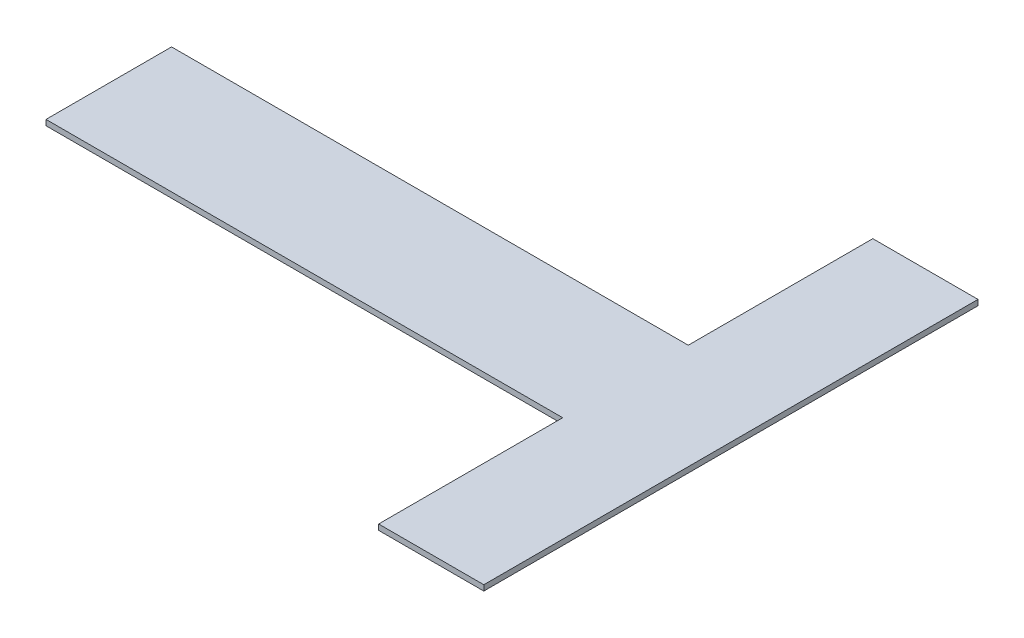
ISO-10303-21;
HEADER;
FILE_DESCRIPTION(('STEP AP214'),'2;1');
FILE_NAME('part.step','',(''),(''),'','','');
FILE_SCHEMA(('AUTOMOTIVE_DESIGN { 1 0 10303 214 1 1 1 1 }'));
ENDSEC;
DATA;
#1=APPLICATION_CONTEXT('core data for automotive mechanical design processes');
#2=APPLICATION_PROTOCOL_DEFINITION('international standard','automotive_design',2000,#1);
#3=PRODUCT_CONTEXT('',#1,'mechanical');
#4=PRODUCT('Part','Part','',(#3));
#5=PRODUCT_RELATED_PRODUCT_CATEGORY('part','',(#4));
#6=PRODUCT_DEFINITION_FORMATION('','',#4);
#7=PRODUCT_DEFINITION_CONTEXT('part definition',#1,'design');
#8=PRODUCT_DEFINITION('design','',#6,#7);
#9=PRODUCT_DEFINITION_SHAPE('','',#8);
#10=(LENGTH_UNIT() NAMED_UNIT(*) SI_UNIT(.MILLI.,.METRE.));
#11=(NAMED_UNIT(*) PLANE_ANGLE_UNIT() SI_UNIT($,.RADIAN.));
#12=(NAMED_UNIT(*) SI_UNIT($,.STERADIAN.) SOLID_ANGLE_UNIT());
#13=UNCERTAINTY_MEASURE_WITH_UNIT(LENGTH_MEASURE(1.E-05),#10,'distance_accuracy_value','');
#14=(GEOMETRIC_REPRESENTATION_CONTEXT(3) GLOBAL_UNCERTAINTY_ASSIGNED_CONTEXT((#13)) GLOBAL_UNIT_ASSIGNED_CONTEXT((#10,
#11,#12)) REPRESENTATION_CONTEXT('',''));
#15=CARTESIAN_POINT('',(0.,0.,0.));
#16=DIRECTION('',(0.,0.,1.));
#17=DIRECTION('',(1.,0.,0.));
#18=AXIS2_PLACEMENT_3D('',#15,#16,#17);
#19=CARTESIAN_POINT('',(-8.631267976045,2.15,0.));
#20=DIRECTION('',(0.,1.,0.));
#21=DIRECTION('',(0.,0.,1.));
#22=AXIS2_PLACEMENT_3D('',#19,#20,#21);
#23=PLANE('',#22);
#24=DIRECTION('',(-1.,0.,0.));
#25=VECTOR('',#24,1.);
#26=CARTESIAN_POINT('',(-8.631267976045,2.15,-1.445796443659));
#27=LINE('',#26,#25);
#28=CARTESIAN_POINT('',(-1.385407258117,2.15,-1.445796443659));
#29=VERTEX_POINT('',#28);
#30=CARTESIAN_POINT('',(-2.319545515188,2.15,-1.445796443659));
#31=VERTEX_POINT('',#30);
#32=EDGE_CURVE('E127',#29,#31,#27,.T.);
#33=ORIENTED_EDGE('',*,*,#32,.F.);
#34=DIRECTION('',(0.,0.,1.));
#35=VECTOR('',#34,1.);
#36=CARTESIAN_POINT('',(-1.385407258117,2.15,0.));
#37=LINE('',#36,#35);
#38=CARTESIAN_POINT('',(-1.385407258117,2.15,-1.779454161517));
#39=VERTEX_POINT('',#38);
#40=EDGE_CURVE('E122',#39,#29,#37,.T.);
#41=ORIENTED_EDGE('',*,*,#40,.F.);
#42=DIRECTION('',(-1.,0.,0.));
#43=VECTOR('',#42,1.);
#44=CARTESIAN_POINT('',(-8.631267976045,2.15,-1.779454161517));
#45=LINE('',#44,#43);
#46=CARTESIAN_POINT('',(-1.195237861878,2.15,-1.779454161517));
#47=VERTEX_POINT('',#46);
#48=EDGE_CURVE('E116',#47,#39,#45,.T.);
#49=ORIENTED_EDGE('',*,*,#48,.F.);
#50=DIRECTION('',(0.,0.,-1.));
#51=VECTOR('',#50,1.);
#52=CARTESIAN_POINT('',(-1.195237861878,2.15,0.));
#53=LINE('',#52,#51);
#54=CARTESIAN_POINT('',(-1.195237861878,2.15,-0.88596805799));
#55=VERTEX_POINT('',#54);
#56=EDGE_CURVE('E110',#55,#47,#53,.T.);
#57=ORIENTED_EDGE('',*,*,#56,.F.);
#58=DIRECTION('',(1.,0.,0.));
#59=VECTOR('',#58,1.);
#60=CARTESIAN_POINT('',(-8.631267976045,2.15,-0.88596805799));
#61=LINE('',#60,#59);
#62=CARTESIAN_POINT('',(-1.385407258117,2.15,-0.88596805799));
#63=VERTEX_POINT('',#62);
#64=EDGE_CURVE('E104',#63,#55,#61,.T.);
#65=ORIENTED_EDGE('',*,*,#64,.F.);
#66=DIRECTION('',(0.,0.,1.));
#67=VECTOR('',#66,1.);
#68=CARTESIAN_POINT('',(-1.385407258117,2.15,0.));
#69=LINE('',#68,#67);
#70=CARTESIAN_POINT('',(-1.385407258117,2.15,-1.218764501409));
#71=VERTEX_POINT('',#70);
#72=EDGE_CURVE('E80',#71,#63,#69,.T.);
#73=ORIENTED_EDGE('',*,*,#72,.F.);
#74=DIRECTION('',(1.,0.,0.));
#75=VECTOR('',#74,1.);
#76=CARTESIAN_POINT('',(-8.631267976045,2.15,-1.218764501409));
#77=LINE('',#76,#75);
#78=CARTESIAN_POINT('',(-2.319545515188,2.15,-1.218764501409));
#79=VERTEX_POINT('',#78);
#80=EDGE_CURVE('E82',#79,#71,#77,.T.);
#81=ORIENTED_EDGE('',*,*,#80,.F.);
#82=DIRECTION('',(0.,0.,1.));
#83=VECTOR('',#82,1.);
#84=CARTESIAN_POINT('',(-2.319545515188,2.15,0.));
#85=LINE('',#84,#83);
#86=EDGE_CURVE('E20',#31,#79,#85,.T.);
#87=ORIENTED_EDGE('',*,*,#86,.F.);
#88=EDGE_LOOP('',(#33,#41,#49,#57,#65,#73,#81,#87));
#89=FACE_BOUND('',#88,.T.);
#90=ADVANCED_FACE('F17',(#89),#23,.F.);
#91=CARTESIAN_POINT('',(-2.319545515188,2.16,0.));
#92=DIRECTION('',(-1.,0.,0.));
#93=DIRECTION('',(0.,0.,1.));
#94=AXIS2_PLACEMENT_3D('',#91,#92,#93);
#95=PLANE('',#94);
#96=DIRECTION('',(0.,0.,1.));
#97=VECTOR('',#96,1.);
#98=CARTESIAN_POINT('',(-2.319545515188,2.16,0.));
#99=LINE('',#98,#97);
#100=CARTESIAN_POINT('',(-2.319545515188,2.16,-1.445796443659));
#101=VERTEX_POINT('',#100);
#102=CARTESIAN_POINT('',(-2.319545515188,2.16,-1.218764501409));
#103=VERTEX_POINT('',#102);
#104=EDGE_CURVE('E131',#101,#103,#99,.T.);
#105=ORIENTED_EDGE('',*,*,#104,.F.);
#106=DIRECTION('',(0.,1.,0.));
#107=VECTOR('',#106,1.);
#108=CARTESIAN_POINT('',(-2.319545515188,2.16,-1.445796443659));
#109=LINE('',#108,#107);
#110=EDGE_CURVE('E93',#31,#101,#109,.T.);
#111=ORIENTED_EDGE('',*,*,#110,.F.);
#112=ORIENTED_EDGE('',*,*,#86,.T.);
#113=DIRECTION('',(0.,1.,0.));
#114=VECTOR('',#113,1.);
#115=CARTESIAN_POINT('',(-2.319545515188,2.16,-1.218764501409));
#116=LINE('',#115,#114);
#117=EDGE_CURVE('E88',#103,#79,#116,.F.);
#118=ORIENTED_EDGE('',*,*,#117,.F.);
#119=EDGE_LOOP('',(#105,#111,#112,#118));
#120=FACE_BOUND('',#119,.T.);
#121=ADVANCED_FACE('F90',(#120),#95,.T.);
#122=CARTESIAN_POINT('',(-8.631267976045,2.16,-1.218764501409));
#123=DIRECTION('',(0.,0.,1.));
#124=DIRECTION('',(1.,0.,0.));
#125=AXIS2_PLACEMENT_3D('',#122,#123,#124);
#126=PLANE('',#125);
#127=DIRECTION('',(1.,0.,0.));
#128=VECTOR('',#127,1.);
#129=CARTESIAN_POINT('',(-8.631267976045,2.16,-1.218764501409));
#130=LINE('',#129,#128);
#131=CARTESIAN_POINT('',(-1.385407258117,2.16,-1.218764501409));
#132=VERTEX_POINT('',#131);
#133=EDGE_CURVE('E97',#103,#132,#130,.T.);
#134=ORIENTED_EDGE('',*,*,#133,.F.);
#135=ORIENTED_EDGE('',*,*,#117,.T.);
#136=ORIENTED_EDGE('',*,*,#80,.T.);
#137=DIRECTION('',(0.,1.,0.));
#138=VECTOR('',#137,1.);
#139=CARTESIAN_POINT('',(-1.385407258117,2.16,-1.218764501409));
#140=LINE('',#139,#138);
#141=EDGE_CURVE('E100',#132,#71,#140,.F.);
#142=ORIENTED_EDGE('',*,*,#141,.F.);
#143=EDGE_LOOP('',(#134,#135,#136,#142));
#144=FACE_BOUND('',#143,.T.);
#145=ADVANCED_FACE('F95',(#144),#126,.T.);
#146=CARTESIAN_POINT('',(-1.385407258117,2.16,0.));
#147=DIRECTION('',(-1.,0.,0.));
#148=DIRECTION('',(0.,0.,1.));
#149=AXIS2_PLACEMENT_3D('',#146,#147,#148);
#150=PLANE('',#149);
#151=DIRECTION('',(0.,0.,1.));
#152=VECTOR('',#151,1.);
#153=CARTESIAN_POINT('',(-1.385407258117,2.16,0.));
#154=LINE('',#153,#152);
#155=CARTESIAN_POINT('',(-1.385407258117,2.16,-0.88596805799));
#156=VERTEX_POINT('',#155);
#157=EDGE_CURVE('E134',#132,#156,#154,.T.);
#158=ORIENTED_EDGE('',*,*,#157,.F.);
#159=ORIENTED_EDGE('',*,*,#141,.T.);
#160=ORIENTED_EDGE('',*,*,#72,.T.);
#161=DIRECTION('',(0.,1.,0.));
#162=VECTOR('',#161,1.);
#163=CARTESIAN_POINT('',(-1.385407258117,2.16,-0.88596805799));
#164=LINE('',#163,#162);
#165=EDGE_CURVE('E107',#156,#63,#164,.F.);
#166=ORIENTED_EDGE('',*,*,#165,.F.);
#167=EDGE_LOOP('',(#158,#159,#160,#166));
#168=FACE_BOUND('',#167,.T.);
#169=ADVANCED_FACE('F161',(#168),#150,.T.);
#170=CARTESIAN_POINT('',(-8.631267976045,2.16,-0.88596805799));
#171=DIRECTION('',(0.,0.,1.));
#172=DIRECTION('',(1.,0.,0.));
#173=AXIS2_PLACEMENT_3D('',#170,#171,#172);
#174=PLANE('',#173);
#175=DIRECTION('',(1.,0.,0.));
#176=VECTOR('',#175,1.);
#177=CARTESIAN_POINT('',(-8.631267976045,2.16,-0.88596805799));
#178=LINE('',#177,#176);
#179=CARTESIAN_POINT('',(-1.195237861878,2.16,-0.88596805799));
#180=VERTEX_POINT('',#179);
#181=EDGE_CURVE('E137',#156,#180,#178,.T.);
#182=ORIENTED_EDGE('',*,*,#181,.F.);
#183=ORIENTED_EDGE('',*,*,#165,.T.);
#184=ORIENTED_EDGE('',*,*,#64,.T.);
#185=DIRECTION('',(0.,1.,0.));
#186=VECTOR('',#185,1.);
#187=CARTESIAN_POINT('',(-1.195237861878,2.16,-0.88596805799));
#188=LINE('',#187,#186);
#189=EDGE_CURVE('E113',#180,#55,#188,.F.);
#190=ORIENTED_EDGE('',*,*,#189,.F.);
#191=EDGE_LOOP('',(#182,#183,#184,#190));
#192=FACE_BOUND('',#191,.T.);
#193=ADVANCED_FACE('F158',(#192),#174,.T.);
#194=CARTESIAN_POINT('',(-1.195237861878,2.16,0.));
#195=DIRECTION('',(1.,0.,0.));
#196=DIRECTION('',(0.,0.,-1.));
#197=AXIS2_PLACEMENT_3D('',#194,#195,#196);
#198=PLANE('',#197);
#199=DIRECTION('',(0.,0.,1.));
#200=VECTOR('',#199,1.);
#201=CARTESIAN_POINT('',(-1.195237861878,2.16,0.));
#202=LINE('',#201,#200);
#203=CARTESIAN_POINT('',(-1.195237861878,2.16,-1.779454161517));
#204=VERTEX_POINT('',#203);
#205=EDGE_CURVE('E140',#180,#204,#202,.F.);
#206=ORIENTED_EDGE('',*,*,#205,.F.);
#207=ORIENTED_EDGE('',*,*,#189,.T.);
#208=ORIENTED_EDGE('',*,*,#56,.T.);
#209=DIRECTION('',(0.,1.,0.));
#210=VECTOR('',#209,1.);
#211=CARTESIAN_POINT('',(-1.195237861878,2.16,-1.779454161517));
#212=LINE('',#211,#210);
#213=EDGE_CURVE('E119',#204,#47,#212,.F.);
#214=ORIENTED_EDGE('',*,*,#213,.F.);
#215=EDGE_LOOP('',(#206,#207,#208,#214));
#216=FACE_BOUND('',#215,.T.);
#217=ADVANCED_FACE('F155',(#216),#198,.T.);
#218=CARTESIAN_POINT('',(-8.631267976045,2.16,-1.779454161517));
#219=DIRECTION('',(0.,0.,-1.));
#220=DIRECTION('',(-1.,0.,0.));
#221=AXIS2_PLACEMENT_3D('',#218,#219,#220);
#222=PLANE('',#221);
#223=DIRECTION('',(1.,0.,0.));
#224=VECTOR('',#223,1.);
#225=CARTESIAN_POINT('',(-8.631267976045,2.16,-1.779454161517));
#226=LINE('',#225,#224);
#227=CARTESIAN_POINT('',(-1.385407258117,2.16,-1.779454161517));
#228=VERTEX_POINT('',#227);
#229=EDGE_CURVE('E143',#204,#228,#226,.F.);
#230=ORIENTED_EDGE('',*,*,#229,.F.);
#231=ORIENTED_EDGE('',*,*,#213,.T.);
#232=ORIENTED_EDGE('',*,*,#48,.T.);
#233=DIRECTION('',(0.,1.,0.));
#234=VECTOR('',#233,1.);
#235=CARTESIAN_POINT('',(-1.385407258117,2.16,-1.779454161517));
#236=LINE('',#235,#234);
#237=EDGE_CURVE('E124',#228,#39,#236,.F.);
#238=ORIENTED_EDGE('',*,*,#237,.F.);
#239=EDGE_LOOP('',(#230,#231,#232,#238));
#240=FACE_BOUND('',#239,.T.);
#241=ADVANCED_FACE('F152',(#240),#222,.T.);
#242=CARTESIAN_POINT('',(-1.385407258117,2.16,0.));
#243=DIRECTION('',(-1.,0.,0.));
#244=DIRECTION('',(0.,0.,1.));
#245=AXIS2_PLACEMENT_3D('',#242,#243,#244);
#246=PLANE('',#245);
#247=DIRECTION('',(0.,0.,1.));
#248=VECTOR('',#247,1.);
#249=CARTESIAN_POINT('',(-1.385407258117,2.16,0.));
#250=LINE('',#249,#248);
#251=CARTESIAN_POINT('',(-1.385407258117,2.16,-1.445796443659));
#252=VERTEX_POINT('',#251);
#253=EDGE_CURVE('E26',#228,#252,#250,.T.);
#254=ORIENTED_EDGE('',*,*,#253,.F.);
#255=ORIENTED_EDGE('',*,*,#237,.T.);
#256=ORIENTED_EDGE('',*,*,#40,.T.);
#257=DIRECTION('',(0.,1.,0.));
#258=VECTOR('',#257,1.);
#259=CARTESIAN_POINT('',(-1.385407258117,2.16,-1.445796443659));
#260=LINE('',#259,#258);
#261=EDGE_CURVE('E35',#252,#29,#260,.F.);
#262=ORIENTED_EDGE('',*,*,#261,.F.);
#263=EDGE_LOOP('',(#254,#255,#256,#262));
#264=FACE_BOUND('',#263,.T.);
#265=ADVANCED_FACE('F150',(#264),#246,.T.);
#266=CARTESIAN_POINT('',(-8.631267976045,2.16,-1.445796443659));
#267=DIRECTION('',(0.,0.,-1.));
#268=DIRECTION('',(-1.,0.,0.));
#269=AXIS2_PLACEMENT_3D('',#266,#267,#268);
#270=PLANE('',#269);
#271=DIRECTION('',(1.,0.,0.));
#272=VECTOR('',#271,1.);
#273=CARTESIAN_POINT('',(-8.631267976045,2.16,-1.445796443659));
#274=LINE('',#273,#272);
#275=EDGE_CURVE('E11',#252,#101,#274,.F.);
#276=ORIENTED_EDGE('',*,*,#275,.F.);
#277=ORIENTED_EDGE('',*,*,#261,.T.);
#278=ORIENTED_EDGE('',*,*,#32,.T.);
#279=ORIENTED_EDGE('',*,*,#110,.T.);
#280=EDGE_LOOP('',(#276,#277,#278,#279));
#281=FACE_BOUND('',#280,.T.);
#282=ADVANCED_FACE('F163',(#281),#270,.T.);
#283=CARTESIAN_POINT('',(-8.631267976045,2.16,0.));
#284=DIRECTION('',(0.,1.,0.));
#285=DIRECTION('',(0.,0.,1.));
#286=AXIS2_PLACEMENT_3D('',#283,#284,#285);
#287=PLANE('',#286);
#288=ORIENTED_EDGE('',*,*,#253,.T.);
#289=ORIENTED_EDGE('',*,*,#275,.T.);
#290=ORIENTED_EDGE('',*,*,#104,.T.);
#291=ORIENTED_EDGE('',*,*,#133,.T.);
#292=ORIENTED_EDGE('',*,*,#157,.T.);
#293=ORIENTED_EDGE('',*,*,#181,.T.);
#294=ORIENTED_EDGE('',*,*,#205,.T.);
#295=ORIENTED_EDGE('',*,*,#229,.T.);
#296=EDGE_LOOP('',(#288,#289,#290,#291,#292,#293,#294,#295));
#297=FACE_BOUND('',#296,.T.);
#298=ADVANCED_FACE('F148',(#297),#287,.T.);
#299=CLOSED_SHELL('',(#90,#121,#145,#169,#193,#217,#241,#265,#282,#298));
#300=MANIFOLD_SOLID_BREP('B1',#299);
#301=ADVANCED_BREP_SHAPE_REPRESENTATION('',(#18,#300),#14);
#302=SHAPE_DEFINITION_REPRESENTATION(#9,#301);
ENDSEC;
END-ISO-10303-21;
